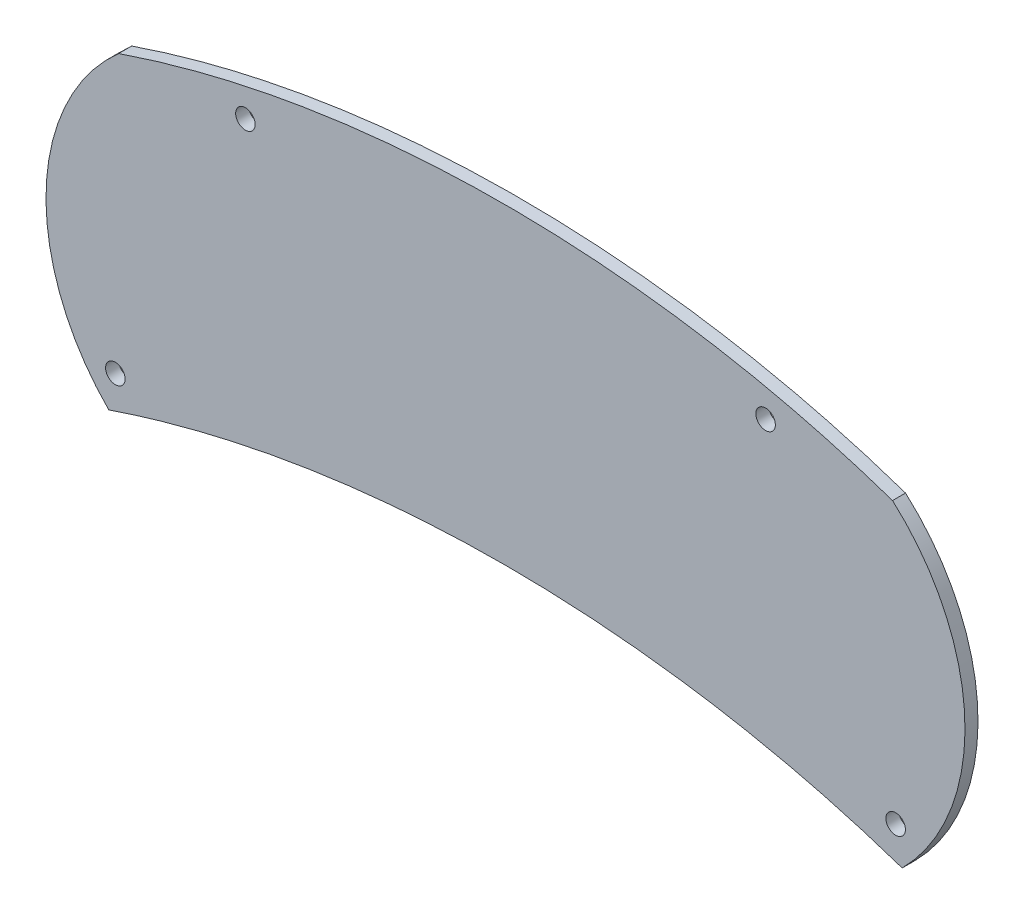
ISO-10303-21;
HEADER;
FILE_DESCRIPTION(('STEP AP214'),'2;1');
FILE_NAME('part.step','',(''),(''),'','','');
FILE_SCHEMA(('AUTOMOTIVE_DESIGN { 1 0 10303 214 1 1 1 1 }'));
ENDSEC;
DATA;
#1=APPLICATION_CONTEXT('core data for automotive mechanical design processes');
#2=APPLICATION_PROTOCOL_DEFINITION('international standard','automotive_design',2000,#1);
#3=PRODUCT_CONTEXT('',#1,'mechanical');
#4=PRODUCT('Part','Part','',(#3));
#5=PRODUCT_RELATED_PRODUCT_CATEGORY('part','',(#4));
#6=PRODUCT_DEFINITION_FORMATION('','',#4);
#7=PRODUCT_DEFINITION_CONTEXT('part definition',#1,'design');
#8=PRODUCT_DEFINITION('design','',#6,#7);
#9=PRODUCT_DEFINITION_SHAPE('','',#8);
#10=(LENGTH_UNIT() NAMED_UNIT(*) SI_UNIT(.MILLI.,.METRE.));
#11=(NAMED_UNIT(*) PLANE_ANGLE_UNIT() SI_UNIT($,.RADIAN.));
#12=(NAMED_UNIT(*) SI_UNIT($,.STERADIAN.) SOLID_ANGLE_UNIT());
#13=UNCERTAINTY_MEASURE_WITH_UNIT(LENGTH_MEASURE(1.E-05),#10,'distance_accuracy_value','');
#14=(GEOMETRIC_REPRESENTATION_CONTEXT(3) GLOBAL_UNCERTAINTY_ASSIGNED_CONTEXT((#13)) GLOBAL_UNIT_ASSIGNED_CONTEXT((#10,
#11,#12)) REPRESENTATION_CONTEXT('',''));
#15=CARTESIAN_POINT('',(0.,0.,0.));
#16=DIRECTION('',(0.,0.,1.));
#17=DIRECTION('',(1.,0.,0.));
#18=AXIS2_PLACEMENT_3D('',#15,#16,#17);
#19=CARTESIAN_POINT('',(-0.21974669990945,130.835125893641,3.));
#20=DIRECTION('',(0.,0.,-1.));
#21=DIRECTION('',(-1.,0.,0.));
#22=AXIS2_PLACEMENT_3D('',#19,#20,#21);
#23=PLANE('',#22);
#24=CARTESIAN_POINT('',(-89.2306232060347,116.448304510497,3.));
#25=CARTESIAN_POINT('',(-82.0228538449197,118.915823941174,3.));
#26=CARTESIAN_POINT('',(-74.7563723152178,121.02859102945,3.));
#27=CARTESIAN_POINT('',(-60.1185935142844,124.620804538016,3.));
#28=CARTESIAN_POINT('',(-52.7471456503857,126.09934104299,3.));
#29=CARTESIAN_POINT('',(-37.9058045798442,128.461584790495,3.));
#30=CARTESIAN_POINT('',(-30.435872975031,129.345060022503,3.));
#31=CARTESIAN_POINT('',(-19.1586566913044,130.233305688785,3.));
#32=CARTESIAN_POINT('',(-13.5019473550076,130.56805696778,3.));
#33=CARTESIAN_POINT('',(-7.81794339163737,130.737887871284,3.));
#34=CARTESIAN_POINT('',(-4.02250528746892,130.81423801793,3.));
#35=CARTESIAN_POINT('',(-2.12028485843131,130.833963634872,3.));
#36=CARTESIAN_POINT('',(7.3824059341779,130.839774928714,3.));
#37=CARTESIAN_POINT('',(14.9631688017768,130.548836526398,3.));
#38=CARTESIAN_POINT('',(26.3021598169117,129.668099271389,3.));
#39=CARTESIAN_POINT('',(30.0764426989166,129.300162486342,3.));
#40=CARTESIAN_POINT('',(37.6140744872787,128.413191154434,3.));
#41=CARTESIAN_POINT('',(41.3795557748917,127.893992916743,3.));
#42=CARTESIAN_POINT('',(52.6453353819208,126.10542090955,3.));
#43=CARTESIAN_POINT('',(60.0822323022672,124.6120961277,3.));
#44=CARTESIAN_POINT('',(74.8016806128558,120.994537875352,3.));
#45=CARTESIAN_POINT('',(82.0844273908808,118.871103079424,3.));
#46=CARTESIAN_POINT('',(89.2826523215664,116.402173549499,3.));
#47=B_SPLINE_CURVE_WITH_KNOTS('',3,(#24,#25,#26,#27,#28,#29,#30,#31,#32,#33,#34,#35,#36,#37,#38,
#39,#40,#41,#42,#43,#44,#45,#46),.UNSPECIFIED.,.F.,.F.,(4,2,2,2,1,2,2,2,2,2,2,4),(0.,0.125,0.25,
0.375,0.4375,0.46875,0.5,0.625,0.6875,0.75,0.875,1.),.UNSPECIFIED.);
#48=CARTESIAN_POINT('',(89.2826523215664,116.402173549499,3.));
#49=VERTEX_POINT('',#48);
#50=CARTESIAN_POINT('',(-89.2306232060347,116.448304510497,3.));
#51=VERTEX_POINT('',#50);
#52=EDGE_CURVE('E97',#49,#51,#47,.F.);
#53=ORIENTED_EDGE('',*,*,#52,.T.);
#54=CARTESIAN_POINT('',(-56.2541289657431,79.2031368698891,3.));
#55=DIRECTION('',(0.,0.,1.));
#56=DIRECTION('',(1.,0.,0.));
#57=AXIS2_PLACEMENT_3D('',#54,#55,#56);
#58=CIRCLE('',#57,49.7458710342571);
#59=CARTESIAN_POINT('',(-91.5104951286137,44.1084032201443,3.));
#60=VERTEX_POINT('',#59);
#61=EDGE_CURVE('E91',#51,#60,#58,.T.);
#62=ORIENTED_EDGE('',*,*,#61,.T.);
#63=CARTESIAN_POINT('',(91.5104951286151,44.1084032201437,3.));
#64=CARTESIAN_POINT('',(84.1199396005471,46.6291479642192,3.));
#65=CARTESIAN_POINT('',(76.6695018842178,48.7896419510719,3.));
#66=CARTESIAN_POINT('',(61.661176509542,52.464211948094,3.));
#67=CARTESIAN_POINT('',(54.1032412518517,53.9780016009985,3.));
#68=CARTESIAN_POINT('',(38.8862713730125,56.3973679590472,3.));
#69=CARTESIAN_POINT('',(31.2272285220345,57.3028951536071,3.));
#70=CARTESIAN_POINT('',(19.6643853468955,58.214324695562,3.));
#71=CARTESIAN_POINT('',(15.797685427451,58.4434227757866,3.));
#72=CARTESIAN_POINT('',(9.97895660832542,58.6746975453514,3.));
#73=CARTESIAN_POINT('',(8.0362646755893,58.7330453518428,3.));
#74=CARTESIAN_POINT('',(4.1446105076145,58.8120188760016,3.));
#75=CARTESIAN_POINT('',(2.19441029879192,58.8326261743354,3.));
#76=CARTESIAN_POINT('',(-7.54496654839546,58.8406282123257,3.));
#77=CARTESIAN_POINT('',(-15.3151569992348,58.5448216083812,3.));
#78=CARTESIAN_POINT('',(-26.9383911859669,57.646594700612,3.));
#79=CARTESIAN_POINT('',(-30.8074414751114,57.2711607459825,3.));
#80=CARTESIAN_POINT('',(-38.534661435719,56.3659965528424,3.));
#81=CARTESIAN_POINT('',(-42.3954313383207,55.8358567433462,3.));
#82=CARTESIAN_POINT('',(-53.9436367533795,54.0102094810462,3.));
#83=CARTESIAN_POINT('',(-61.5677146077057,52.4855299272633,3.));
#84=CARTESIAN_POINT('',(-76.659755812135,48.7935822768363,3.));
#85=CARTESIAN_POINT('',(-84.1277596266368,46.6264807371631,3.));
#86=CARTESIAN_POINT('',(-91.5104951286138,44.1084032201442,3.));
#87=B_SPLINE_CURVE_WITH_KNOTS('',3,(#63,#64,#65,#66,#67,#68,#69,#70,#71,#72,#73,#74,#75,#76,#77,
#78,#79,#80,#81,#82,#83,#84,#85,#86),.UNSPECIFIED.,.F.,.F.,(4,2,2,2,2,2,2,2,2,2,2,4),(0.,0.125,
0.25,0.375,0.4375,0.46875,0.5,0.625,0.6875,0.75,0.875,1.),.UNSPECIFIED.);
#88=CARTESIAN_POINT('',(91.5104951286151,44.1084032201437,3.));
#89=VERTEX_POINT('',#88);
#90=EDGE_CURVE('E94',#60,#89,#87,.F.);
#91=ORIENTED_EDGE('',*,*,#90,.T.);
#92=CARTESIAN_POINT('',(56.2541289657431,79.2031368698891,3.));
#93=DIRECTION('',(0.,0.,1.));
#94=DIRECTION('',(1.,0.,0.));
#95=AXIS2_PLACEMENT_3D('',#92,#93,#94);
#96=CIRCLE('',#95,49.7458710342586);
#97=EDGE_CURVE('E60',#89,#49,#96,.T.);
#98=ORIENTED_EDGE('',*,*,#97,.T.);
#99=EDGE_LOOP('',(#53,#62,#91,#98));
#100=FACE_BOUND('',#99,.T.);
#101=CARTESIAN_POINT('',(-90.,52.1508761221292,3.));
#102=DIRECTION('',(0.,0.,1.));
#103=DIRECTION('',(1.,0.,0.));
#104=AXIS2_PLACEMENT_3D('',#101,#102,#103);
#105=CIRCLE('',#104,2.25);
#106=CARTESIAN_POINT('',(-87.75,52.1508761221292,3.));
#107=VERTEX_POINT('',#106);
#108=EDGE_CURVE('E143',#107,#107,#105,.T.);
#109=ORIENTED_EDGE('',*,*,#108,.F.);
#110=EDGE_LOOP('',(#109));
#111=FACE_BOUND('',#110,.T.);
#112=CARTESIAN_POINT('',(-60.,118.,3.));
#113=DIRECTION('',(0.,0.,1.));
#114=DIRECTION('',(1.,0.,0.));
#115=AXIS2_PLACEMENT_3D('',#112,#113,#114);
#116=CIRCLE('',#115,2.25);
#117=CARTESIAN_POINT('',(-57.75,118.,3.));
#118=VERTEX_POINT('',#117);
#119=EDGE_CURVE('E144',#118,#118,#116,.T.);
#120=ORIENTED_EDGE('',*,*,#119,.F.);
#121=EDGE_LOOP('',(#120));
#122=FACE_BOUND('',#121,.T.);
#123=CARTESIAN_POINT('',(60.,118.,3.));
#124=DIRECTION('',(0.,0.,1.));
#125=DIRECTION('',(1.,0.,0.));
#126=AXIS2_PLACEMENT_3D('',#123,#124,#125);
#127=CIRCLE('',#126,2.25);
#128=CARTESIAN_POINT('',(62.25,118.,3.));
#129=VERTEX_POINT('',#128);
#130=EDGE_CURVE('E151',#129,#129,#127,.T.);
#131=ORIENTED_EDGE('',*,*,#130,.F.);
#132=EDGE_LOOP('',(#131));
#133=FACE_BOUND('',#132,.T.);
#134=CARTESIAN_POINT('',(90.,52.1508761221292,3.));
#135=DIRECTION('',(0.,0.,1.));
#136=DIRECTION('',(1.,0.,0.));
#137=AXIS2_PLACEMENT_3D('',#134,#135,#136);
#138=CIRCLE('',#137,2.25);
#139=CARTESIAN_POINT('',(92.25,52.1508761221292,3.));
#140=VERTEX_POINT('',#139);
#141=EDGE_CURVE('E157',#140,#140,#138,.T.);
#142=ORIENTED_EDGE('',*,*,#141,.F.);
#143=EDGE_LOOP('',(#142));
#144=FACE_BOUND('',#143,.T.);
#145=ADVANCED_FACE('F37',(#100,#111,#122,#133,#144),#23,.F.);
#146=CARTESIAN_POINT('',(-0.21974669990945,130.835125893641,0.));
#147=DIRECTION('',(0.,0.,-1.));
#148=DIRECTION('',(-1.,0.,0.));
#149=AXIS2_PLACEMENT_3D('',#146,#147,#148);
#150=PLANE('',#149);
#151=CARTESIAN_POINT('',(60.,118.,0.));
#152=DIRECTION('',(0.,0.,1.));
#153=DIRECTION('',(1.,0.,0.));
#154=AXIS2_PLACEMENT_3D('',#151,#152,#153);
#155=CIRCLE('',#154,2.25);
#156=CARTESIAN_POINT('',(62.25,118.,0.));
#157=VERTEX_POINT('',#156);
#158=EDGE_CURVE('E154',#157,#157,#155,.T.);
#159=ORIENTED_EDGE('',*,*,#158,.T.);
#160=EDGE_LOOP('',(#159));
#161=FACE_BOUND('',#160,.T.);
#162=CARTESIAN_POINT('',(-90.,52.1508761221292,0.));
#163=DIRECTION('',(0.,0.,1.));
#164=DIRECTION('',(1.,0.,0.));
#165=AXIS2_PLACEMENT_3D('',#162,#163,#164);
#166=CIRCLE('',#165,2.25);
#167=CARTESIAN_POINT('',(-87.75,52.1508761221292,0.));
#168=VERTEX_POINT('',#167);
#169=EDGE_CURVE('E137',#168,#168,#166,.T.);
#170=ORIENTED_EDGE('',*,*,#169,.T.);
#171=EDGE_LOOP('',(#170));
#172=FACE_BOUND('',#171,.T.);
#173=CARTESIAN_POINT('',(89.2826523215664,116.402173549499,0.));
#174=CARTESIAN_POINT('',(82.0844273908808,118.871103079424,0.));
#175=CARTESIAN_POINT('',(74.8016806128558,120.994537875352,0.));
#176=CARTESIAN_POINT('',(60.0822323022672,124.6120961277,0.));
#177=CARTESIAN_POINT('',(52.6453353819208,126.10542090955,0.));
#178=CARTESIAN_POINT('',(41.3795557748917,127.893992916743,0.));
#179=CARTESIAN_POINT('',(37.6140744872787,128.413191154434,0.));
#180=CARTESIAN_POINT('',(30.0764426989166,129.300162486342,0.));
#181=CARTESIAN_POINT('',(26.3021598169117,129.668099271389,0.));
#182=CARTESIAN_POINT('',(14.9631688017768,130.548836526398,0.));
#183=CARTESIAN_POINT('',(7.3824059341779,130.839774928714,0.));
#184=CARTESIAN_POINT('',(-2.12028485843131,130.833963634872,0.));
#185=CARTESIAN_POINT('',(-4.02250528746892,130.81423801793,0.));
#186=CARTESIAN_POINT('',(-7.81794339163737,130.737887871284,0.));
#187=CARTESIAN_POINT('',(-13.5019473550076,130.56805696778,0.));
#188=CARTESIAN_POINT('',(-19.1586566913044,130.233305688785,0.));
#189=CARTESIAN_POINT('',(-30.435872975031,129.345060022503,0.));
#190=CARTESIAN_POINT('',(-37.9058045798442,128.461584790495,0.));
#191=CARTESIAN_POINT('',(-52.7471456503857,126.09934104299,0.));
#192=CARTESIAN_POINT('',(-60.1185935142844,124.620804538016,0.));
#193=CARTESIAN_POINT('',(-74.7563723152178,121.02859102945,0.));
#194=CARTESIAN_POINT('',(-82.0228538449197,118.915823941174,0.));
#195=CARTESIAN_POINT('',(-89.2306232060347,116.448304510497,0.));
#196=B_SPLINE_CURVE_WITH_KNOTS('',3,(#173,#174,#175,#176,#177,#178,#179,#180,#181,#182,#183,
#184,#185,#186,#187,#188,#189,#190,#191,#192,#193,#194,#195),.UNSPECIFIED.,.F.,.F.,(4,2,2,2,2,2,
2,1,2,2,2,4),(0.,0.125,0.25,0.3125,0.375,0.5,0.53125,0.5625,0.625,0.75,0.875,1.),.UNSPECIFIED.);
#197=CARTESIAN_POINT('',(89.2826523215664,116.402173549499,0.));
#198=VERTEX_POINT('',#197);
#199=CARTESIAN_POINT('',(-89.2306232060347,116.448304510497,0.));
#200=VERTEX_POINT('',#199);
#201=EDGE_CURVE('E147',#198,#200,#196,.T.);
#202=ORIENTED_EDGE('',*,*,#201,.F.);
#203=CARTESIAN_POINT('',(56.2541289657431,79.2031368698891,0.));
#204=DIRECTION('',(0.,0.,1.));
#205=DIRECTION('',(1.,0.,0.));
#206=AXIS2_PLACEMENT_3D('',#203,#204,#205);
#207=CIRCLE('',#206,49.7458710342586);
#208=CARTESIAN_POINT('',(91.5104951286151,44.1084032201437,0.));
#209=VERTEX_POINT('',#208);
#210=EDGE_CURVE('E84',#209,#198,#207,.T.);
#211=ORIENTED_EDGE('',*,*,#210,.F.);
#212=CARTESIAN_POINT('',(-91.5104951286138,44.1084032201442,0.));
#213=CARTESIAN_POINT('',(-84.1277596266368,46.6264807371631,0.));
#214=CARTESIAN_POINT('',(-76.659755812135,48.7935822768363,0.));
#215=CARTESIAN_POINT('',(-61.5677146077057,52.4855299272633,0.));
#216=CARTESIAN_POINT('',(-53.9436367533795,54.0102094810462,0.));
#217=CARTESIAN_POINT('',(-42.3954313383207,55.8358567433462,0.));
#218=CARTESIAN_POINT('',(-38.534661435719,56.3659965528424,0.));
#219=CARTESIAN_POINT('',(-30.8074414751114,57.2711607459825,0.));
#220=CARTESIAN_POINT('',(-26.9383911859669,57.646594700612,0.));
#221=CARTESIAN_POINT('',(-15.3151569992348,58.5448216083812,0.));
#222=CARTESIAN_POINT('',(-7.54496654839546,58.8406282123257,0.));
#223=CARTESIAN_POINT('',(2.19441029879192,58.8326261743354,0.));
#224=CARTESIAN_POINT('',(4.1446105076145,58.8120188760016,0.));
#225=CARTESIAN_POINT('',(8.0362646755893,58.7330453518428,0.));
#226=CARTESIAN_POINT('',(9.97895660832542,58.6746975453514,0.));
#227=CARTESIAN_POINT('',(15.797685427451,58.4434227757866,0.));
#228=CARTESIAN_POINT('',(19.6643853468955,58.214324695562,0.));
#229=CARTESIAN_POINT('',(31.2272285220345,57.3028951536071,0.));
#230=CARTESIAN_POINT('',(38.8862713730125,56.3973679590472,0.));
#231=CARTESIAN_POINT('',(54.1032412518517,53.9780016009985,0.));
#232=CARTESIAN_POINT('',(61.661176509542,52.464211948094,0.));
#233=CARTESIAN_POINT('',(76.6695018842178,48.7896419510719,0.));
#234=CARTESIAN_POINT('',(84.1199396005471,46.6291479642192,0.));
#235=CARTESIAN_POINT('',(91.5104951286151,44.1084032201437,0.));
#236=B_SPLINE_CURVE_WITH_KNOTS('',3,(#212,#213,#214,#215,#216,#217,#218,#219,#220,#221,#222,
#223,#224,#225,#226,#227,#228,#229,#230,#231,#232,#233,#234,#235),.UNSPECIFIED.,.F.,.F.,(4,2,2,
2,2,2,2,2,2,2,2,4),(0.,0.125,0.25,0.3125,0.375,0.5,0.53125,0.5625,0.625,0.75,0.875,1.),.UNSPECIFIED.);
#237=CARTESIAN_POINT('',(-91.5104951286137,44.1084032201443,0.));
#238=VERTEX_POINT('',#237);
#239=EDGE_CURVE('E77',#238,#209,#236,.T.);
#240=ORIENTED_EDGE('',*,*,#239,.F.);
#241=CARTESIAN_POINT('',(-56.2541289657431,79.2031368698891,0.));
#242=DIRECTION('',(0.,0.,1.));
#243=DIRECTION('',(1.,0.,0.));
#244=AXIS2_PLACEMENT_3D('',#241,#242,#243);
#245=CIRCLE('',#244,49.7458710342571);
#246=EDGE_CURVE('E102',#200,#238,#245,.T.);
#247=ORIENTED_EDGE('',*,*,#246,.F.);
#248=EDGE_LOOP('',(#202,#211,#240,#247));
#249=FACE_BOUND('',#248,.T.);
#250=CARTESIAN_POINT('',(-60.,118.,0.));
#251=DIRECTION('',(0.,0.,1.));
#252=DIRECTION('',(1.,0.,0.));
#253=AXIS2_PLACEMENT_3D('',#250,#251,#252);
#254=CIRCLE('',#253,2.25);
#255=CARTESIAN_POINT('',(-57.75,118.,0.));
#256=VERTEX_POINT('',#255);
#257=EDGE_CURVE('E148',#256,#256,#254,.T.);
#258=ORIENTED_EDGE('',*,*,#257,.T.);
#259=EDGE_LOOP('',(#258));
#260=FACE_BOUND('',#259,.T.);
#261=CARTESIAN_POINT('',(90.,52.1508761221292,0.));
#262=DIRECTION('',(0.,0.,1.));
#263=DIRECTION('',(1.,0.,0.));
#264=AXIS2_PLACEMENT_3D('',#261,#262,#263);
#265=CIRCLE('',#264,2.25);
#266=CARTESIAN_POINT('',(92.25,52.1508761221292,0.));
#267=VERTEX_POINT('',#266);
#268=EDGE_CURVE('E160',#267,#267,#265,.T.);
#269=ORIENTED_EDGE('',*,*,#268,.T.);
#270=EDGE_LOOP('',(#269));
#271=FACE_BOUND('',#270,.T.);
#272=ADVANCED_FACE('F170',(#161,#172,#249,#260,#271),#150,.T.);
#273=CARTESIAN_POINT('',(89.2826523215664,116.402173549499,3.));
#274=CARTESIAN_POINT('',(82.0844273908808,118.871103079424,3.));
#275=CARTESIAN_POINT('',(74.8016806128558,120.994537875352,3.));
#276=CARTESIAN_POINT('',(60.0822323022672,124.6120961277,3.));
#277=CARTESIAN_POINT('',(52.6453353819208,126.10542090955,3.));
#278=CARTESIAN_POINT('',(41.3795557748917,127.893992916743,3.));
#279=CARTESIAN_POINT('',(37.6140744872787,128.413191154434,3.));
#280=CARTESIAN_POINT('',(30.0764426989166,129.300162486342,3.));
#281=CARTESIAN_POINT('',(26.3021598169117,129.668099271389,3.));
#282=CARTESIAN_POINT('',(14.9631688017768,130.548836526398,3.));
#283=CARTESIAN_POINT('',(7.3824059341779,130.839774928714,3.));
#284=CARTESIAN_POINT('',(-2.12028485843131,130.833963634872,3.));
#285=CARTESIAN_POINT('',(-4.02250528746892,130.81423801793,3.));
#286=CARTESIAN_POINT('',(-7.81794339163737,130.737887871284,3.));
#287=CARTESIAN_POINT('',(-13.5019473550076,130.56805696778,3.));
#288=CARTESIAN_POINT('',(-19.1586566913044,130.233305688785,3.));
#289=CARTESIAN_POINT('',(-30.435872975031,129.345060022503,3.));
#290=CARTESIAN_POINT('',(-37.9058045798442,128.461584790495,3.));
#291=CARTESIAN_POINT('',(-52.7471456503857,126.09934104299,3.));
#292=CARTESIAN_POINT('',(-60.1185935142844,124.620804538016,3.));
#293=CARTESIAN_POINT('',(-74.7563723152178,121.02859102945,3.));
#294=CARTESIAN_POINT('',(-82.0228538449197,118.915823941174,3.));
#295=CARTESIAN_POINT('',(-89.2306232060347,116.448304510497,3.));
#296=B_SPLINE_CURVE_WITH_KNOTS('',3,(#273,#274,#275,#276,#277,#278,#279,#280,#281,#282,#283,
#284,#285,#286,#287,#288,#289,#290,#291,#292,#293,#294,#295),.UNSPECIFIED.,.F.,.F.,(4,2,2,2,2,2,
2,1,2,2,2,4),(0.,0.125,0.25,0.3125,0.375,0.5,0.53125,0.5625,0.625,0.75,0.875,1.),.UNSPECIFIED.);
#297=DIRECTION('',(0.,0.,-1.));
#298=VECTOR('',#297,1.);
#299=SURFACE_OF_LINEAR_EXTRUSION('',#296,#298);
#300=ORIENTED_EDGE('',*,*,#201,.T.);
#301=DIRECTION('',(0.,0.,-1.));
#302=VECTOR('',#301,1.);
#303=CARTESIAN_POINT('',(-89.2306232060347,116.448304510497,3.));
#304=LINE('',#303,#302);
#305=EDGE_CURVE('E11',#51,#200,#304,.T.);
#306=ORIENTED_EDGE('',*,*,#305,.F.);
#307=ORIENTED_EDGE('',*,*,#52,.F.);
#308=DIRECTION('',(0.,0.,-1.));
#309=VECTOR('',#308,1.);
#310=CARTESIAN_POINT('',(89.2826523215664,116.402173549499,3.));
#311=LINE('',#310,#309);
#312=EDGE_CURVE('E196',#49,#198,#311,.T.);
#313=ORIENTED_EDGE('',*,*,#312,.T.);
#314=EDGE_LOOP('',(#300,#306,#307,#313));
#315=FACE_BOUND('',#314,.T.);
#316=ADVANCED_FACE('F39',(#315),#299,.F.);
#317=CARTESIAN_POINT('',(-56.2541289657431,79.2031368698891,3.));
#318=DIRECTION('',(0.,0.,-1.));
#319=DIRECTION('',(-1.,0.,0.));
#320=AXIS2_PLACEMENT_3D('',#317,#318,#319);
#321=CYLINDRICAL_SURFACE('',#320,49.7458710342571);
#322=ORIENTED_EDGE('',*,*,#246,.T.);
#323=DIRECTION('',(0.,0.,-1.));
#324=VECTOR('',#323,1.);
#325=CARTESIAN_POINT('',(-91.5104951286137,44.1084032201443,3.));
#326=LINE('',#325,#324);
#327=EDGE_CURVE('E51',#60,#238,#326,.T.);
#328=ORIENTED_EDGE('',*,*,#327,.F.);
#329=ORIENTED_EDGE('',*,*,#61,.F.);
#330=ORIENTED_EDGE('',*,*,#305,.T.);
#331=EDGE_LOOP('',(#322,#328,#329,#330));
#332=FACE_BOUND('',#331,.T.);
#333=ADVANCED_FACE('F101',(#332),#321,.T.);
#334=CARTESIAN_POINT('',(-91.5104951286138,44.1084032201442,3.));
#335=CARTESIAN_POINT('',(-84.1277596266368,46.6264807371631,3.));
#336=CARTESIAN_POINT('',(-76.659755812135,48.7935822768363,3.));
#337=CARTESIAN_POINT('',(-61.5677146077057,52.4855299272633,3.));
#338=CARTESIAN_POINT('',(-53.9436367533795,54.0102094810462,3.));
#339=CARTESIAN_POINT('',(-42.3954313383207,55.8358567433462,3.));
#340=CARTESIAN_POINT('',(-38.534661435719,56.3659965528424,3.));
#341=CARTESIAN_POINT('',(-30.8074414751114,57.2711607459825,3.));
#342=CARTESIAN_POINT('',(-26.9383911859669,57.646594700612,3.));
#343=CARTESIAN_POINT('',(-15.3151569992348,58.5448216083812,3.));
#344=CARTESIAN_POINT('',(-7.54496654839546,58.8406282123257,3.));
#345=CARTESIAN_POINT('',(2.19441029879192,58.8326261743354,3.));
#346=CARTESIAN_POINT('',(4.1446105076145,58.8120188760016,3.));
#347=CARTESIAN_POINT('',(8.0362646755893,58.7330453518428,3.));
#348=CARTESIAN_POINT('',(9.97895660832542,58.6746975453514,3.));
#349=CARTESIAN_POINT('',(15.797685427451,58.4434227757866,3.));
#350=CARTESIAN_POINT('',(19.6643853468955,58.214324695562,3.));
#351=CARTESIAN_POINT('',(31.2272285220345,57.3028951536071,3.));
#352=CARTESIAN_POINT('',(38.8862713730125,56.3973679590472,3.));
#353=CARTESIAN_POINT('',(54.1032412518517,53.9780016009985,3.));
#354=CARTESIAN_POINT('',(61.661176509542,52.464211948094,3.));
#355=CARTESIAN_POINT('',(76.6695018842178,48.7896419510719,3.));
#356=CARTESIAN_POINT('',(84.1199396005471,46.6291479642192,3.));
#357=CARTESIAN_POINT('',(91.5104951286151,44.1084032201437,3.));
#358=B_SPLINE_CURVE_WITH_KNOTS('',3,(#334,#335,#336,#337,#338,#339,#340,#341,#342,#343,#344,
#345,#346,#347,#348,#349,#350,#351,#352,#353,#354,#355,#356,#357),.UNSPECIFIED.,.F.,.F.,(4,2,2,
2,2,2,2,2,2,2,2,4),(0.,0.125,0.25,0.3125,0.375,0.5,0.53125,0.5625,0.625,0.75,0.875,1.),.UNSPECIFIED.);
#359=DIRECTION('',(0.,0.,-1.));
#360=VECTOR('',#359,1.);
#361=SURFACE_OF_LINEAR_EXTRUSION('',#358,#360);
#362=ORIENTED_EDGE('',*,*,#239,.T.);
#363=DIRECTION('',(0.,0.,-1.));
#364=VECTOR('',#363,1.);
#365=CARTESIAN_POINT('',(91.5104951286151,44.1084032201437,3.));
#366=LINE('',#365,#364);
#367=EDGE_CURVE('E103',#89,#209,#366,.T.);
#368=ORIENTED_EDGE('',*,*,#367,.F.);
#369=ORIENTED_EDGE('',*,*,#90,.F.);
#370=ORIENTED_EDGE('',*,*,#327,.T.);
#371=EDGE_LOOP('',(#362,#368,#369,#370));
#372=FACE_BOUND('',#371,.T.);
#373=ADVANCED_FACE('F106',(#372),#361,.F.);
#374=CARTESIAN_POINT('',(56.2541289657431,79.2031368698891,3.));
#375=DIRECTION('',(0.,0.,-1.));
#376=DIRECTION('',(-1.,0.,0.));
#377=AXIS2_PLACEMENT_3D('',#374,#375,#376);
#378=CYLINDRICAL_SURFACE('',#377,49.7458710342586);
#379=ORIENTED_EDGE('',*,*,#210,.T.);
#380=ORIENTED_EDGE('',*,*,#312,.F.);
#381=ORIENTED_EDGE('',*,*,#97,.F.);
#382=ORIENTED_EDGE('',*,*,#367,.T.);
#383=EDGE_LOOP('',(#379,#380,#381,#382));
#384=FACE_BOUND('',#383,.T.);
#385=ADVANCED_FACE('F125',(#384),#378,.T.);
#386=CARTESIAN_POINT('',(-90.,52.1508761221292,3.));
#387=DIRECTION('',(0.,0.,-1.));
#388=DIRECTION('',(-1.,0.,0.));
#389=AXIS2_PLACEMENT_3D('',#386,#387,#388);
#390=CYLINDRICAL_SURFACE('',#389,2.25);
#391=ORIENTED_EDGE('',*,*,#108,.T.);
#392=EDGE_LOOP('',(#391));
#393=FACE_BOUND('',#392,.T.);
#394=ORIENTED_EDGE('',*,*,#169,.F.);
#395=EDGE_LOOP('',(#394));
#396=FACE_BOUND('',#395,.T.);
#397=ADVANCED_FACE('F177',(#393,#396),#390,.F.);
#398=CARTESIAN_POINT('',(-60.,118.,3.));
#399=DIRECTION('',(0.,0.,-1.));
#400=DIRECTION('',(-1.,0.,0.));
#401=AXIS2_PLACEMENT_3D('',#398,#399,#400);
#402=CYLINDRICAL_SURFACE('',#401,2.25);
#403=ORIENTED_EDGE('',*,*,#119,.T.);
#404=EDGE_LOOP('',(#403));
#405=FACE_BOUND('',#404,.T.);
#406=ORIENTED_EDGE('',*,*,#257,.F.);
#407=EDGE_LOOP('',(#406));
#408=FACE_BOUND('',#407,.T.);
#409=ADVANCED_FACE('F271',(#405,#408),#402,.F.);
#410=CARTESIAN_POINT('',(60.,118.,3.));
#411=DIRECTION('',(0.,0.,-1.));
#412=DIRECTION('',(-1.,0.,0.));
#413=AXIS2_PLACEMENT_3D('',#410,#411,#412);
#414=CYLINDRICAL_SURFACE('',#413,2.25);
#415=ORIENTED_EDGE('',*,*,#130,.T.);
#416=EDGE_LOOP('',(#415));
#417=FACE_BOUND('',#416,.T.);
#418=ORIENTED_EDGE('',*,*,#158,.F.);
#419=EDGE_LOOP('',(#418));
#420=FACE_BOUND('',#419,.T.);
#421=ADVANCED_FACE('F278',(#417,#420),#414,.F.);
#422=CARTESIAN_POINT('',(90.,52.1508761221292,3.));
#423=DIRECTION('',(0.,0.,-1.));
#424=DIRECTION('',(-1.,0.,0.));
#425=AXIS2_PLACEMENT_3D('',#422,#423,#424);
#426=CYLINDRICAL_SURFACE('',#425,2.25);
#427=ORIENTED_EDGE('',*,*,#141,.T.);
#428=EDGE_LOOP('',(#427));
#429=FACE_BOUND('',#428,.T.);
#430=ORIENTED_EDGE('',*,*,#268,.F.);
#431=EDGE_LOOP('',(#430));
#432=FACE_BOUND('',#431,.T.);
#433=ADVANCED_FACE('F166',(#429,#432),#426,.F.);
#434=CLOSED_SHELL('',(#145,#272,#316,#333,#373,#385,#397,#409,#421,#433));
#435=MANIFOLD_SOLID_BREP('B2',#434);
#436=ADVANCED_BREP_SHAPE_REPRESENTATION('',(#18,#435),#14);
#437=SHAPE_DEFINITION_REPRESENTATION(#9,#436);
ENDSEC;
END-ISO-10303-21;
